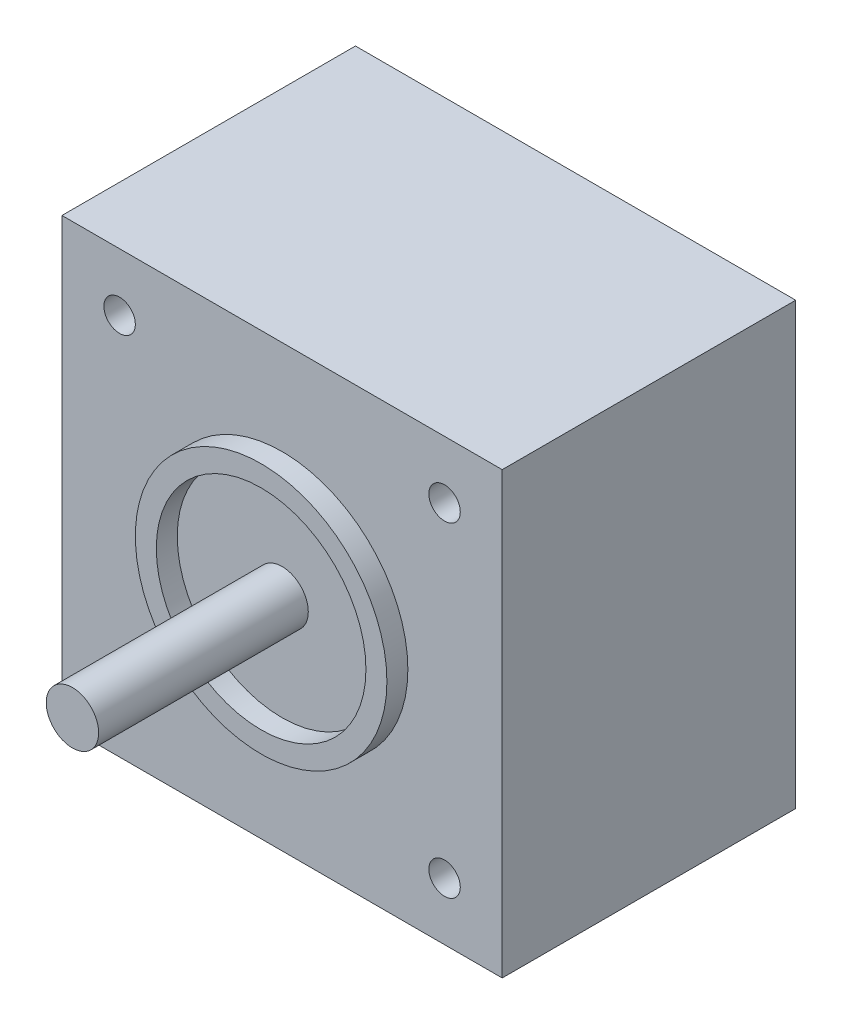
ISO-10303-21;
HEADER;
FILE_DESCRIPTION(('STEP AP214'),'2;1');
FILE_NAME('part.step','',(''),(''),'','','');
FILE_SCHEMA(('AUTOMOTIVE_DESIGN { 1 0 10303 214 1 1 1 1 }'));
ENDSEC;
DATA;
#1=APPLICATION_CONTEXT('core data for automotive mechanical design processes');
#2=APPLICATION_PROTOCOL_DEFINITION('international standard','automotive_design',2000,#1);
#3=PRODUCT_CONTEXT('',#1,'mechanical');
#4=PRODUCT('Part','Part','',(#3));
#5=PRODUCT_RELATED_PRODUCT_CATEGORY('part','',(#4));
#6=PRODUCT_DEFINITION_FORMATION('','',#4);
#7=PRODUCT_DEFINITION_CONTEXT('part definition',#1,'design');
#8=PRODUCT_DEFINITION('design','',#6,#7);
#9=PRODUCT_DEFINITION_SHAPE('','',#8);
#10=(LENGTH_UNIT() NAMED_UNIT(*) SI_UNIT(.MILLI.,.METRE.));
#11=(NAMED_UNIT(*) PLANE_ANGLE_UNIT() SI_UNIT($,.RADIAN.));
#12=(NAMED_UNIT(*) SI_UNIT($,.STERADIAN.) SOLID_ANGLE_UNIT());
#13=UNCERTAINTY_MEASURE_WITH_UNIT(LENGTH_MEASURE(1.E-05),#10,'distance_accuracy_value','');
#14=(GEOMETRIC_REPRESENTATION_CONTEXT(3) GLOBAL_UNCERTAINTY_ASSIGNED_CONTEXT((#13)) GLOBAL_UNIT_ASSIGNED_CONTEXT((#10,
#11,#12)) REPRESENTATION_CONTEXT('',''));
#15=CARTESIAN_POINT('',(0.,0.,0.));
#16=DIRECTION('',(0.,0.,1.));
#17=DIRECTION('',(1.,0.,0.));
#18=AXIS2_PLACEMENT_3D('',#15,#16,#17);
#19=CARTESIAN_POINT('',(-21.,-21.,28.));
#20=DIRECTION('',(0.,1.,0.));
#21=DIRECTION('',(0.,0.,1.));
#22=AXIS2_PLACEMENT_3D('',#19,#20,#21);
#23=PLANE('',#22);
#24=DIRECTION('',(0.,0.,1.));
#25=VECTOR('',#24,1.);
#26=CARTESIAN_POINT('',(7.49999999999999,-21.,0.));
#27=LINE('',#26,#25);
#28=CARTESIAN_POINT('',(7.49999999999999,-21.,0.));
#29=VERTEX_POINT('',#28);
#30=CARTESIAN_POINT('',(7.49999999999999,-21.,8.));
#31=VERTEX_POINT('',#30);
#32=EDGE_CURVE('E158',#29,#31,#27,.T.);
#33=ORIENTED_EDGE('',*,*,#32,.F.);
#34=DIRECTION('',(1.,0.,0.));
#35=VECTOR('',#34,1.);
#36=CARTESIAN_POINT('',(-21.,-21.,0.));
#37=LINE('',#36,#35);
#38=CARTESIAN_POINT('',(21.,-21.,0.));
#39=VERTEX_POINT('',#38);
#40=EDGE_CURVE('E248',#29,#39,#37,.T.);
#41=ORIENTED_EDGE('',*,*,#40,.T.);
#42=DIRECTION('',(0.,0.,-1.));
#43=VECTOR('',#42,1.);
#44=CARTESIAN_POINT('',(21.,-21.,28.));
#45=LINE('',#44,#43);
#46=CARTESIAN_POINT('',(21.,-21.,28.));
#47=VERTEX_POINT('',#46);
#48=EDGE_CURVE('E241',#47,#39,#45,.T.);
#49=ORIENTED_EDGE('',*,*,#48,.F.);
#50=DIRECTION('',(1.,0.,0.));
#51=VECTOR('',#50,1.);
#52=CARTESIAN_POINT('',(-21.,-21.,28.));
#53=LINE('',#52,#51);
#54=CARTESIAN_POINT('',(-21.,-21.,28.));
#55=VERTEX_POINT('',#54);
#56=EDGE_CURVE('E239',#55,#47,#53,.T.);
#57=ORIENTED_EDGE('',*,*,#56,.F.);
#58=DIRECTION('',(0.,0.,-1.));
#59=VECTOR('',#58,1.);
#60=CARTESIAN_POINT('',(-21.,-21.,28.));
#61=LINE('',#60,#59);
#62=CARTESIAN_POINT('',(-21.,-21.,0.));
#63=VERTEX_POINT('',#62);
#64=EDGE_CURVE('E252',#55,#63,#61,.T.);
#65=ORIENTED_EDGE('',*,*,#64,.T.);
#66=CARTESIAN_POINT('',(-7.50000000000001,-21.,0.));
#67=VERTEX_POINT('',#66);
#68=EDGE_CURVE('E235',#63,#67,#37,.T.);
#69=ORIENTED_EDGE('',*,*,#68,.T.);
#70=DIRECTION('',(0.,0.,-1.));
#71=VECTOR('',#70,1.);
#72=CARTESIAN_POINT('',(-7.50000000000001,-21.,0.));
#73=LINE('',#72,#71);
#74=CARTESIAN_POINT('',(-7.50000000000001,-21.,8.));
#75=VERTEX_POINT('',#74);
#76=EDGE_CURVE('E166',#75,#67,#73,.T.);
#77=ORIENTED_EDGE('',*,*,#76,.F.);
#78=DIRECTION('',(-1.,0.,0.));
#79=VECTOR('',#78,1.);
#80=CARTESIAN_POINT('',(7.49999999999999,-21.,8.));
#81=LINE('',#80,#79);
#82=EDGE_CURVE('E57',#31,#75,#81,.T.);
#83=ORIENTED_EDGE('',*,*,#82,.F.);
#84=EDGE_LOOP('',(#33,#41,#49,#57,#65,#69,#77,#83));
#85=FACE_BOUND('',#84,.T.);
#86=ADVANCED_FACE('F34',(#85),#23,.F.);
#87=CARTESIAN_POINT('',(21.,21.,28.));
#88=DIRECTION('',(-1.,0.,0.));
#89=DIRECTION('',(0.,0.,1.));
#90=AXIS2_PLACEMENT_3D('',#87,#88,#89);
#91=PLANE('',#90);
#92=DIRECTION('',(0.,1.,0.));
#93=VECTOR('',#92,1.);
#94=CARTESIAN_POINT('',(21.,21.,0.));
#95=LINE('',#94,#93);
#96=CARTESIAN_POINT('',(21.,21.,0.));
#97=VERTEX_POINT('',#96);
#98=EDGE_CURVE('E228',#39,#97,#95,.T.);
#99=ORIENTED_EDGE('',*,*,#98,.T.);
#100=DIRECTION('',(0.,0.,-1.));
#101=VECTOR('',#100,1.);
#102=CARTESIAN_POINT('',(21.,21.,28.));
#103=LINE('',#102,#101);
#104=CARTESIAN_POINT('',(21.,21.,28.));
#105=VERTEX_POINT('',#104);
#106=EDGE_CURVE('E11',#105,#97,#103,.T.);
#107=ORIENTED_EDGE('',*,*,#106,.F.);
#108=DIRECTION('',(0.,1.,0.));
#109=VECTOR('',#108,1.);
#110=CARTESIAN_POINT('',(21.,21.,28.));
#111=LINE('',#110,#109);
#112=EDGE_CURVE('E231',#47,#105,#111,.T.);
#113=ORIENTED_EDGE('',*,*,#112,.F.);
#114=ORIENTED_EDGE('',*,*,#48,.T.);
#115=EDGE_LOOP('',(#99,#107,#113,#114));
#116=FACE_BOUND('',#115,.T.);
#117=ADVANCED_FACE('F36',(#116),#91,.F.);
#118=CARTESIAN_POINT('',(-21.,21.,28.));
#119=DIRECTION('',(0.,-1.,0.));
#120=DIRECTION('',(0.,0.,-1.));
#121=AXIS2_PLACEMENT_3D('',#118,#119,#120);
#122=PLANE('',#121);
#123=DIRECTION('',(-1.,0.,0.));
#124=VECTOR('',#123,1.);
#125=CARTESIAN_POINT('',(-21.,21.,0.));
#126=LINE('',#125,#124);
#127=CARTESIAN_POINT('',(-21.,21.,0.));
#128=VERTEX_POINT('',#127);
#129=EDGE_CURVE('E244',#97,#128,#126,.T.);
#130=ORIENTED_EDGE('',*,*,#129,.T.);
#131=DIRECTION('',(0.,0.,-1.));
#132=VECTOR('',#131,1.);
#133=CARTESIAN_POINT('',(-21.,21.,28.));
#134=LINE('',#133,#132);
#135=CARTESIAN_POINT('',(-21.,21.,28.));
#136=VERTEX_POINT('',#135);
#137=EDGE_CURVE('E42',#136,#128,#134,.T.);
#138=ORIENTED_EDGE('',*,*,#137,.F.);
#139=DIRECTION('',(-1.,0.,0.));
#140=VECTOR('',#139,1.);
#141=CARTESIAN_POINT('',(-21.,21.,28.));
#142=LINE('',#141,#140);
#143=EDGE_CURVE('E234',#105,#136,#142,.T.);
#144=ORIENTED_EDGE('',*,*,#143,.F.);
#145=ORIENTED_EDGE('',*,*,#106,.T.);
#146=EDGE_LOOP('',(#130,#138,#144,#145));
#147=FACE_BOUND('',#146,.T.);
#148=ADVANCED_FACE('F287',(#147),#122,.F.);
#149=CARTESIAN_POINT('',(-21.,21.,28.));
#150=DIRECTION('',(1.,0.,0.));
#151=DIRECTION('',(0.,1.,0.));
#152=AXIS2_PLACEMENT_3D('',#149,#150,#151);
#153=PLANE('',#152);
#154=DIRECTION('',(0.,-1.,0.));
#155=VECTOR('',#154,1.);
#156=CARTESIAN_POINT('',(-21.,21.,0.));
#157=LINE('',#156,#155);
#158=EDGE_CURVE('E246',#128,#63,#157,.T.);
#159=ORIENTED_EDGE('',*,*,#158,.T.);
#160=ORIENTED_EDGE('',*,*,#64,.F.);
#161=DIRECTION('',(0.,-1.,0.));
#162=VECTOR('',#161,1.);
#163=CARTESIAN_POINT('',(-21.,21.,28.));
#164=LINE('',#163,#162);
#165=EDGE_CURVE('E237',#136,#55,#164,.T.);
#166=ORIENTED_EDGE('',*,*,#165,.F.);
#167=ORIENTED_EDGE('',*,*,#137,.T.);
#168=EDGE_LOOP('',(#159,#160,#166,#167));
#169=FACE_BOUND('',#168,.T.);
#170=ADVANCED_FACE('F259',(#169),#153,.F.);
#171=CARTESIAN_POINT('',(0.,0.,28.));
#172=DIRECTION('',(0.,0.,1.));
#173=DIRECTION('',(1.,0.,0.));
#174=AXIS2_PLACEMENT_3D('',#171,#172,#173);
#175=PLANE('',#174);
#176=CARTESIAN_POINT('',(0.,0.,28.));
#177=DIRECTION('',(0.,0.,1.));
#178=DIRECTION('',(1.,0.,0.));
#179=AXIS2_PLACEMENT_3D('',#176,#177,#178);
#180=CIRCLE('',#179,12.);
#181=CARTESIAN_POINT('',(12.,0.,28.));
#182=VERTEX_POINT('',#181);
#183=EDGE_CURVE('E198',#182,#182,#180,.T.);
#184=ORIENTED_EDGE('',*,*,#183,.F.);
#185=EDGE_LOOP('',(#184));
#186=FACE_BOUND('',#185,.T.);
#187=CARTESIAN_POINT('',(15.5,-15.5,28.));
#188=DIRECTION('',(0.,0.,1.));
#189=DIRECTION('',(1.,0.,0.));
#190=AXIS2_PLACEMENT_3D('',#187,#188,#189);
#191=CIRCLE('',#190,1.5);
#192=CARTESIAN_POINT('',(17.,-15.5,28.));
#193=VERTEX_POINT('',#192);
#194=EDGE_CURVE('E204',#193,#193,#191,.T.);
#195=ORIENTED_EDGE('',*,*,#194,.F.);
#196=EDGE_LOOP('',(#195));
#197=FACE_BOUND('',#196,.T.);
#198=CARTESIAN_POINT('',(-15.5,-15.5,28.));
#199=DIRECTION('',(0.,0.,1.));
#200=DIRECTION('',(1.,0.,0.));
#201=AXIS2_PLACEMENT_3D('',#198,#199,#200);
#202=CIRCLE('',#201,1.5);
#203=CARTESIAN_POINT('',(-14.,-15.5,28.));
#204=VERTEX_POINT('',#203);
#205=EDGE_CURVE('E217',#204,#204,#202,.T.);
#206=ORIENTED_EDGE('',*,*,#205,.F.);
#207=EDGE_LOOP('',(#206));
#208=FACE_BOUND('',#207,.T.);
#209=CARTESIAN_POINT('',(-15.5,15.5,28.));
#210=DIRECTION('',(0.,0.,1.));
#211=DIRECTION('',(1.,0.,0.));
#212=AXIS2_PLACEMENT_3D('',#209,#210,#211);
#213=CIRCLE('',#212,1.5);
#214=CARTESIAN_POINT('',(-14.,15.5,28.));
#215=VERTEX_POINT('',#214);
#216=EDGE_CURVE('E211',#215,#215,#213,.T.);
#217=ORIENTED_EDGE('',*,*,#216,.F.);
#218=EDGE_LOOP('',(#217));
#219=FACE_BOUND('',#218,.T.);
#220=CARTESIAN_POINT('',(15.5,15.5,28.));
#221=DIRECTION('',(0.,0.,1.));
#222=DIRECTION('',(1.,0.,0.));
#223=AXIS2_PLACEMENT_3D('',#220,#221,#222);
#224=CIRCLE('',#223,1.5);
#225=CARTESIAN_POINT('',(17.,15.5,28.));
#226=VERTEX_POINT('',#225);
#227=EDGE_CURVE('E210',#226,#226,#224,.T.);
#228=ORIENTED_EDGE('',*,*,#227,.F.);
#229=EDGE_LOOP('',(#228));
#230=FACE_BOUND('',#229,.T.);
#231=ORIENTED_EDGE('',*,*,#112,.T.);
#232=ORIENTED_EDGE('',*,*,#143,.T.);
#233=ORIENTED_EDGE('',*,*,#165,.T.);
#234=ORIENTED_EDGE('',*,*,#56,.T.);
#235=EDGE_LOOP('',(#231,#232,#233,#234));
#236=FACE_BOUND('',#235,.T.);
#237=ADVANCED_FACE('F286',(#186,#197,#208,#219,#230,#236),#175,.T.);
#238=CARTESIAN_POINT('',(0.,0.,0.));
#239=DIRECTION('',(0.,0.,1.));
#240=DIRECTION('',(1.,0.,0.));
#241=AXIS2_PLACEMENT_3D('',#238,#239,#240);
#242=PLANE('',#241);
#243=ORIENTED_EDGE('',*,*,#98,.F.);
#244=ORIENTED_EDGE('',*,*,#40,.F.);
#245=DIRECTION('',(0.,1.,0.));
#246=VECTOR('',#245,1.);
#247=CARTESIAN_POINT('',(7.49999999999999,-27.,0.));
#248=LINE('',#247,#246);
#249=CARTESIAN_POINT('',(7.49999999999999,-27.,0.));
#250=VERTEX_POINT('',#249);
#251=EDGE_CURVE('E172',#250,#29,#248,.T.);
#252=ORIENTED_EDGE('',*,*,#251,.F.);
#253=DIRECTION('',(1.,0.,0.));
#254=VECTOR('',#253,1.);
#255=CARTESIAN_POINT('',(7.49999999999999,-27.,0.));
#256=LINE('',#255,#254);
#257=CARTESIAN_POINT('',(-7.50000000000001,-27.,0.));
#258=VERTEX_POINT('',#257);
#259=EDGE_CURVE('E170',#258,#250,#256,.T.);
#260=ORIENTED_EDGE('',*,*,#259,.F.);
#261=DIRECTION('',(0.,1.,0.));
#262=VECTOR('',#261,1.);
#263=CARTESIAN_POINT('',(-7.50000000000001,-27.,0.));
#264=LINE('',#263,#262);
#265=EDGE_CURVE('E180',#258,#67,#264,.T.);
#266=ORIENTED_EDGE('',*,*,#265,.T.);
#267=ORIENTED_EDGE('',*,*,#68,.F.);
#268=ORIENTED_EDGE('',*,*,#158,.F.);
#269=ORIENTED_EDGE('',*,*,#129,.F.);
#270=EDGE_LOOP('',(#243,#244,#252,#260,#266,#267,#268,#269));
#271=FACE_BOUND('',#270,.T.);
#272=ADVANCED_FACE('F265',(#271),#242,.F.);
#273=CARTESIAN_POINT('',(15.5,15.5,18.));
#274=DIRECTION('',(0.,0.,1.));
#275=DIRECTION('',(1.,0.,0.));
#276=AXIS2_PLACEMENT_3D('',#273,#274,#275);
#277=CYLINDRICAL_SURFACE('',#276,1.5);
#278=CARTESIAN_POINT('',(15.5,15.5,18.));
#279=DIRECTION('',(0.,0.,1.));
#280=DIRECTION('',(1.,0.,0.));
#281=AXIS2_PLACEMENT_3D('',#278,#279,#280);
#282=CIRCLE('',#281,1.5);
#283=CARTESIAN_POINT('',(17.,15.5,18.));
#284=VERTEX_POINT('',#283);
#285=EDGE_CURVE('E225',#284,#284,#282,.T.);
#286=ORIENTED_EDGE('',*,*,#285,.F.);
#287=EDGE_LOOP('',(#286));
#288=FACE_BOUND('',#287,.T.);
#289=ORIENTED_EDGE('',*,*,#227,.T.);
#290=EDGE_LOOP('',(#289));
#291=FACE_BOUND('',#290,.T.);
#292=ADVANCED_FACE('F301',(#288,#291),#277,.F.);
#293=CARTESIAN_POINT('',(15.5,15.5,18.));
#294=DIRECTION('',(0.,0.,1.));
#295=DIRECTION('',(1.,0.,0.));
#296=AXIS2_PLACEMENT_3D('',#293,#294,#295);
#297=PLANE('',#296);
#298=ORIENTED_EDGE('',*,*,#285,.T.);
#299=EDGE_LOOP('',(#298));
#300=FACE_BOUND('',#299,.T.);
#301=ADVANCED_FACE('F307',(#300),#297,.T.);
#302=CARTESIAN_POINT('',(-15.5,15.5,18.));
#303=DIRECTION('',(0.,0.,1.));
#304=DIRECTION('',(1.,0.,0.));
#305=AXIS2_PLACEMENT_3D('',#302,#303,#304);
#306=CYLINDRICAL_SURFACE('',#305,1.5);
#307=CARTESIAN_POINT('',(-15.5,15.5,18.));
#308=DIRECTION('',(0.,0.,1.));
#309=DIRECTION('',(1.,0.,0.));
#310=AXIS2_PLACEMENT_3D('',#307,#308,#309);
#311=CIRCLE('',#310,1.5);
#312=CARTESIAN_POINT('',(-14.,15.5,18.));
#313=VERTEX_POINT('',#312);
#314=EDGE_CURVE('E207',#313,#313,#311,.T.);
#315=ORIENTED_EDGE('',*,*,#314,.F.);
#316=EDGE_LOOP('',(#315));
#317=FACE_BOUND('',#316,.T.);
#318=ORIENTED_EDGE('',*,*,#216,.T.);
#319=EDGE_LOOP('',(#318));
#320=FACE_BOUND('',#319,.T.);
#321=ADVANCED_FACE('F311',(#317,#320),#306,.F.);
#322=CARTESIAN_POINT('',(-15.5,15.5,18.));
#323=DIRECTION('',(0.,0.,1.));
#324=DIRECTION('',(1.,0.,0.));
#325=AXIS2_PLACEMENT_3D('',#322,#323,#324);
#326=PLANE('',#325);
#327=ORIENTED_EDGE('',*,*,#314,.T.);
#328=EDGE_LOOP('',(#327));
#329=FACE_BOUND('',#328,.T.);
#330=ADVANCED_FACE('F326',(#329),#326,.T.);
#331=CARTESIAN_POINT('',(-15.5,-15.5,18.));
#332=DIRECTION('',(0.,0.,1.));
#333=DIRECTION('',(1.,0.,0.));
#334=AXIS2_PLACEMENT_3D('',#331,#332,#333);
#335=CYLINDRICAL_SURFACE('',#334,1.5);
#336=CARTESIAN_POINT('',(-15.5,-15.5,18.));
#337=DIRECTION('',(0.,0.,1.));
#338=DIRECTION('',(1.,0.,0.));
#339=AXIS2_PLACEMENT_3D('',#336,#337,#338);
#340=CIRCLE('',#339,1.5);
#341=CARTESIAN_POINT('',(-14.,-15.5,18.));
#342=VERTEX_POINT('',#341);
#343=EDGE_CURVE('E214',#342,#342,#340,.T.);
#344=ORIENTED_EDGE('',*,*,#343,.F.);
#345=EDGE_LOOP('',(#344));
#346=FACE_BOUND('',#345,.T.);
#347=ORIENTED_EDGE('',*,*,#205,.T.);
#348=EDGE_LOOP('',(#347));
#349=FACE_BOUND('',#348,.T.);
#350=ADVANCED_FACE('F323',(#346,#349),#335,.F.);
#351=CARTESIAN_POINT('',(-15.5,-15.5,18.));
#352=DIRECTION('',(0.,0.,1.));
#353=DIRECTION('',(1.,0.,0.));
#354=AXIS2_PLACEMENT_3D('',#351,#352,#353);
#355=PLANE('',#354);
#356=ORIENTED_EDGE('',*,*,#343,.T.);
#357=EDGE_LOOP('',(#356));
#358=FACE_BOUND('',#357,.T.);
#359=ADVANCED_FACE('F317',(#358),#355,.T.);
#360=CARTESIAN_POINT('',(15.5,-15.5,18.));
#361=DIRECTION('',(0.,0.,1.));
#362=DIRECTION('',(1.,0.,0.));
#363=AXIS2_PLACEMENT_3D('',#360,#361,#362);
#364=CYLINDRICAL_SURFACE('',#363,1.5);
#365=CARTESIAN_POINT('',(15.5,-15.5,18.));
#366=DIRECTION('',(0.,0.,1.));
#367=DIRECTION('',(1.,0.,0.));
#368=AXIS2_PLACEMENT_3D('',#365,#366,#367);
#369=CIRCLE('',#368,1.5);
#370=CARTESIAN_POINT('',(17.,-15.5,18.));
#371=VERTEX_POINT('',#370);
#372=EDGE_CURVE('E220',#371,#371,#369,.T.);
#373=ORIENTED_EDGE('',*,*,#372,.F.);
#374=EDGE_LOOP('',(#373));
#375=FACE_BOUND('',#374,.T.);
#376=ORIENTED_EDGE('',*,*,#194,.T.);
#377=EDGE_LOOP('',(#376));
#378=FACE_BOUND('',#377,.T.);
#379=ADVANCED_FACE('F313',(#375,#378),#364,.F.);
#380=CARTESIAN_POINT('',(15.5,-15.5,18.));
#381=DIRECTION('',(0.,0.,1.));
#382=DIRECTION('',(1.,0.,0.));
#383=AXIS2_PLACEMENT_3D('',#380,#381,#382);
#384=PLANE('',#383);
#385=ORIENTED_EDGE('',*,*,#372,.T.);
#386=EDGE_LOOP('',(#385));
#387=FACE_BOUND('',#386,.T.);
#388=ADVANCED_FACE('F316',(#387),#384,.T.);
#389=CARTESIAN_POINT('',(0.,0.,30.));
#390=DIRECTION('',(0.,0.,-1.));
#391=DIRECTION('',(-1.,0.,0.));
#392=AXIS2_PLACEMENT_3D('',#389,#390,#391);
#393=CYLINDRICAL_SURFACE('',#392,12.);
#394=CARTESIAN_POINT('',(0.,0.,30.));
#395=DIRECTION('',(0.,0.,1.));
#396=DIRECTION('',(1.,0.,0.));
#397=AXIS2_PLACEMENT_3D('',#394,#395,#396);
#398=CIRCLE('',#397,12.);
#399=CARTESIAN_POINT('',(12.,0.,30.));
#400=VERTEX_POINT('',#399);
#401=EDGE_CURVE('E201',#400,#400,#398,.T.);
#402=ORIENTED_EDGE('',*,*,#401,.F.);
#403=EDGE_LOOP('',(#402));
#404=FACE_BOUND('',#403,.T.);
#405=ORIENTED_EDGE('',*,*,#183,.T.);
#406=EDGE_LOOP('',(#405));
#407=FACE_BOUND('',#406,.T.);
#408=ADVANCED_FACE('F321',(#404,#407),#393,.T.);
#409=CARTESIAN_POINT('',(0.,0.,30.));
#410=DIRECTION('',(0.,0.,1.));
#411=DIRECTION('',(1.,0.,0.));
#412=AXIS2_PLACEMENT_3D('',#409,#410,#411);
#413=PLANE('',#412);
#414=CARTESIAN_POINT('',(0.,0.,30.));
#415=DIRECTION('',(0.,0.,1.));
#416=DIRECTION('',(1.,0.,0.));
#417=AXIS2_PLACEMENT_3D('',#414,#415,#416);
#418=CIRCLE('',#417,10.);
#419=CARTESIAN_POINT('',(10.,0.,30.));
#420=VERTEX_POINT('',#419);
#421=EDGE_CURVE('E192',#420,#420,#418,.T.);
#422=ORIENTED_EDGE('',*,*,#421,.F.);
#423=EDGE_LOOP('',(#422));
#424=FACE_BOUND('',#423,.T.);
#425=ORIENTED_EDGE('',*,*,#401,.T.);
#426=EDGE_LOOP('',(#425));
#427=FACE_BOUND('',#426,.T.);
#428=ADVANCED_FACE('F339',(#424,#427),#413,.T.);
#429=CARTESIAN_POINT('',(0.,0.,28.));
#430=DIRECTION('',(0.,0.,1.));
#431=DIRECTION('',(1.,0.,0.));
#432=AXIS2_PLACEMENT_3D('',#429,#430,#431);
#433=CYLINDRICAL_SURFACE('',#432,10.);
#434=CARTESIAN_POINT('',(0.,0.,28.));
#435=DIRECTION('',(0.,0.,1.));
#436=DIRECTION('',(1.,0.,0.));
#437=AXIS2_PLACEMENT_3D('',#434,#435,#436);
#438=CIRCLE('',#437,10.);
#439=CARTESIAN_POINT('',(10.,0.,28.));
#440=VERTEX_POINT('',#439);
#441=EDGE_CURVE('E195',#440,#440,#438,.T.);
#442=ORIENTED_EDGE('',*,*,#441,.F.);
#443=EDGE_LOOP('',(#442));
#444=FACE_BOUND('',#443,.T.);
#445=ORIENTED_EDGE('',*,*,#421,.T.);
#446=EDGE_LOOP('',(#445));
#447=FACE_BOUND('',#446,.T.);
#448=ADVANCED_FACE('F343',(#444,#447),#433,.F.);
#449=CARTESIAN_POINT('',(0.,0.,28.));
#450=DIRECTION('',(0.,0.,1.));
#451=DIRECTION('',(1.,0.,0.));
#452=AXIS2_PLACEMENT_3D('',#449,#450,#451);
#453=PLANE('',#452);
#454=CARTESIAN_POINT('',(0.,0.,28.));
#455=DIRECTION('',(0.,0.,1.));
#456=DIRECTION('',(1.,0.,0.));
#457=AXIS2_PLACEMENT_3D('',#454,#455,#456);
#458=CIRCLE('',#457,2.5);
#459=CARTESIAN_POINT('',(2.5,0.,28.));
#460=VERTEX_POINT('',#459);
#461=EDGE_CURVE('E188',#460,#460,#458,.T.);
#462=ORIENTED_EDGE('',*,*,#461,.F.);
#463=EDGE_LOOP('',(#462));
#464=FACE_BOUND('',#463,.T.);
#465=ORIENTED_EDGE('',*,*,#441,.T.);
#466=EDGE_LOOP('',(#465));
#467=FACE_BOUND('',#466,.T.);
#468=ADVANCED_FACE('F347',(#464,#467),#453,.T.);
#469=CARTESIAN_POINT('',(0.,0.,48.));
#470=DIRECTION('',(0.,0.,-1.));
#471=DIRECTION('',(-1.,0.,0.));
#472=AXIS2_PLACEMENT_3D('',#469,#470,#471);
#473=CYLINDRICAL_SURFACE('',#472,2.5);
#474=CARTESIAN_POINT('',(0.,0.,48.));
#475=DIRECTION('',(0.,0.,1.));
#476=DIRECTION('',(1.,0.,0.));
#477=AXIS2_PLACEMENT_3D('',#474,#475,#476);
#478=CIRCLE('',#477,2.5);
#479=CARTESIAN_POINT('',(2.5,0.,48.));
#480=VERTEX_POINT('',#479);
#481=EDGE_CURVE('E189',#480,#480,#478,.T.);
#482=ORIENTED_EDGE('',*,*,#481,.F.);
#483=EDGE_LOOP('',(#482));
#484=FACE_BOUND('',#483,.T.);
#485=ORIENTED_EDGE('',*,*,#461,.T.);
#486=EDGE_LOOP('',(#485));
#487=FACE_BOUND('',#486,.T.);
#488=ADVANCED_FACE('F351',(#484,#487),#473,.T.);
#489=CARTESIAN_POINT('',(0.,0.,48.));
#490=DIRECTION('',(0.,0.,1.));
#491=DIRECTION('',(1.,0.,0.));
#492=AXIS2_PLACEMENT_3D('',#489,#490,#491);
#493=PLANE('',#492);
#494=ORIENTED_EDGE('',*,*,#481,.T.);
#495=EDGE_LOOP('',(#494));
#496=FACE_BOUND('',#495,.T.);
#497=ADVANCED_FACE('F355',(#496),#493,.T.);
#498=CARTESIAN_POINT('',(7.49999999999999,-27.,0.));
#499=DIRECTION('',(-1.,0.,0.));
#500=DIRECTION('',(0.,0.,1.));
#501=AXIS2_PLACEMENT_3D('',#498,#499,#500);
#502=PLANE('',#501);
#503=ORIENTED_EDGE('',*,*,#32,.T.);
#504=DIRECTION('',(0.,1.,0.));
#505=VECTOR('',#504,1.);
#506=CARTESIAN_POINT('',(7.49999999999999,-27.,8.));
#507=LINE('',#506,#505);
#508=CARTESIAN_POINT('',(7.49999999999999,-27.,8.));
#509=VERTEX_POINT('',#508);
#510=EDGE_CURVE('E186',#509,#31,#507,.T.);
#511=ORIENTED_EDGE('',*,*,#510,.F.);
#512=DIRECTION('',(0.,0.,1.));
#513=VECTOR('',#512,1.);
#514=CARTESIAN_POINT('',(7.49999999999999,-27.,0.));
#515=LINE('',#514,#513);
#516=EDGE_CURVE('E162',#250,#509,#515,.T.);
#517=ORIENTED_EDGE('',*,*,#516,.F.);
#518=ORIENTED_EDGE('',*,*,#251,.T.);
#519=EDGE_LOOP('',(#503,#511,#517,#518));
#520=FACE_BOUND('',#519,.T.);
#521=ADVANCED_FACE('F278',(#520),#502,.F.);
#522=CARTESIAN_POINT('',(7.49999999999999,-27.,8.));
#523=DIRECTION('',(0.,0.,-1.));
#524=DIRECTION('',(-1.,0.,0.));
#525=AXIS2_PLACEMENT_3D('',#522,#523,#524);
#526=PLANE('',#525);
#527=ORIENTED_EDGE('',*,*,#82,.T.);
#528=DIRECTION('',(0.,1.,0.));
#529=VECTOR('',#528,1.);
#530=CARTESIAN_POINT('',(-7.50000000000001,-27.,8.));
#531=LINE('',#530,#529);
#532=CARTESIAN_POINT('',(-7.50000000000001,-27.,8.));
#533=VERTEX_POINT('',#532);
#534=EDGE_CURVE('E183',#533,#75,#531,.T.);
#535=ORIENTED_EDGE('',*,*,#534,.F.);
#536=DIRECTION('',(-1.,0.,0.));
#537=VECTOR('',#536,1.);
#538=CARTESIAN_POINT('',(7.49999999999999,-27.,8.));
#539=LINE('',#538,#537);
#540=EDGE_CURVE('E165',#509,#533,#539,.T.);
#541=ORIENTED_EDGE('',*,*,#540,.F.);
#542=ORIENTED_EDGE('',*,*,#510,.T.);
#543=EDGE_LOOP('',(#527,#535,#541,#542));
#544=FACE_BOUND('',#543,.T.);
#545=ADVANCED_FACE('F274',(#544),#526,.F.);
#546=CARTESIAN_POINT('',(-7.50000000000001,-27.,0.));
#547=DIRECTION('',(1.,0.,0.));
#548=DIRECTION('',(0.,0.,-1.));
#549=AXIS2_PLACEMENT_3D('',#546,#547,#548);
#550=PLANE('',#549);
#551=ORIENTED_EDGE('',*,*,#76,.T.);
#552=ORIENTED_EDGE('',*,*,#265,.F.);
#553=DIRECTION('',(0.,0.,-1.));
#554=VECTOR('',#553,1.);
#555=CARTESIAN_POINT('',(-7.50000000000001,-27.,0.));
#556=LINE('',#555,#554);
#557=EDGE_CURVE('E168',#533,#258,#556,.T.);
#558=ORIENTED_EDGE('',*,*,#557,.F.);
#559=ORIENTED_EDGE('',*,*,#534,.T.);
#560=EDGE_LOOP('',(#551,#552,#558,#559));
#561=FACE_BOUND('',#560,.T.);
#562=ADVANCED_FACE('F270',(#561),#550,.F.);
#563=CARTESIAN_POINT('',(0.,-27.,0.));
#564=DIRECTION('',(0.,-1.,0.));
#565=DIRECTION('',(0.,0.,-1.));
#566=AXIS2_PLACEMENT_3D('',#563,#564,#565);
#567=PLANE('',#566);
#568=DIRECTION('',(0.,0.,-1.));
#569=VECTOR('',#568,1.);
#570=CARTESIAN_POINT('',(-6.50000000000001,-27.,7.));
#571=LINE('',#570,#569);
#572=CARTESIAN_POINT('',(-6.50000000000001,-27.,7.));
#573=VERTEX_POINT('',#572);
#574=CARTESIAN_POINT('',(-6.50000000000001,-27.,0.999999999999998));
#575=VERTEX_POINT('',#574);
#576=EDGE_CURVE('E49',#573,#575,#571,.T.);
#577=ORIENTED_EDGE('',*,*,#576,.F.);
#578=DIRECTION('',(-1.,0.,0.));
#579=VECTOR('',#578,1.);
#580=CARTESIAN_POINT('',(-6.50000000000001,-27.,7.));
#581=LINE('',#580,#579);
#582=CARTESIAN_POINT('',(6.49999999999998,-27.,7.));
#583=VERTEX_POINT('',#582);
#584=EDGE_CURVE('E143',#583,#573,#581,.T.);
#585=ORIENTED_EDGE('',*,*,#584,.F.);
#586=DIRECTION('',(0.,0.,1.));
#587=VECTOR('',#586,1.);
#588=CARTESIAN_POINT('',(6.49999999999998,-27.,7.));
#589=LINE('',#588,#587);
#590=CARTESIAN_POINT('',(6.49999999999998,-27.,1.));
#591=VERTEX_POINT('',#590);
#592=EDGE_CURVE('E146',#591,#583,#589,.T.);
#593=ORIENTED_EDGE('',*,*,#592,.F.);
#594=DIRECTION('',(1.,0.,0.));
#595=VECTOR('',#594,1.);
#596=CARTESIAN_POINT('',(-6.50000000000001,-27.,0.999999999999998));
#597=LINE('',#596,#595);
#598=EDGE_CURVE('E152',#575,#591,#597,.T.);
#599=ORIENTED_EDGE('',*,*,#598,.F.);
#600=EDGE_LOOP('',(#577,#585,#593,#599));
#601=FACE_BOUND('',#600,.T.);
#602=ORIENTED_EDGE('',*,*,#516,.T.);
#603=ORIENTED_EDGE('',*,*,#540,.T.);
#604=ORIENTED_EDGE('',*,*,#557,.T.);
#605=ORIENTED_EDGE('',*,*,#259,.T.);
#606=EDGE_LOOP('',(#602,#603,#604,#605));
#607=FACE_BOUND('',#606,.T.);
#608=ADVANCED_FACE('F366',(#601,#607),#567,.T.);
#609=CARTESIAN_POINT('',(-6.50000000000001,-21.,7.));
#610=DIRECTION('',(-1.,0.,0.));
#611=DIRECTION('',(0.,0.,1.));
#612=AXIS2_PLACEMENT_3D('',#609,#610,#611);
#613=PLANE('',#612);
#614=ORIENTED_EDGE('',*,*,#576,.T.);
#615=DIRECTION('',(0.,-1.,0.));
#616=VECTOR('',#615,1.);
#617=CARTESIAN_POINT('',(-6.50000000000001,-21.,0.999999999999998));
#618=LINE('',#617,#616);
#619=CARTESIAN_POINT('',(-6.50000000000001,-21.,0.999999999999998));
#620=VERTEX_POINT('',#619);
#621=EDGE_CURVE('E121',#620,#575,#618,.T.);
#622=ORIENTED_EDGE('',*,*,#621,.F.);
#623=DIRECTION('',(0.,0.,-1.));
#624=VECTOR('',#623,1.);
#625=CARTESIAN_POINT('',(-6.50000000000001,-21.,7.));
#626=LINE('',#625,#624);
#627=CARTESIAN_POINT('',(-6.50000000000001,-21.,7.));
#628=VERTEX_POINT('',#627);
#629=EDGE_CURVE('E125',#628,#620,#626,.T.);
#630=ORIENTED_EDGE('',*,*,#629,.F.);
#631=DIRECTION('',(0.,-1.,0.));
#632=VECTOR('',#631,1.);
#633=CARTESIAN_POINT('',(-6.50000000000001,-21.,7.));
#634=LINE('',#633,#632);
#635=EDGE_CURVE('E156',#628,#573,#634,.T.);
#636=ORIENTED_EDGE('',*,*,#635,.T.);
#637=EDGE_LOOP('',(#614,#622,#630,#636));
#638=FACE_BOUND('',#637,.T.);
#639=ADVANCED_FACE('F123',(#638),#613,.F.);
#640=CARTESIAN_POINT('',(-6.50000000000001,-21.,7.));
#641=DIRECTION('',(0.,0.,1.));
#642=DIRECTION('',(1.,0.,0.));
#643=AXIS2_PLACEMENT_3D('',#640,#641,#642);
#644=PLANE('',#643);
#645=ORIENTED_EDGE('',*,*,#584,.T.);
#646=ORIENTED_EDGE('',*,*,#635,.F.);
#647=DIRECTION('',(-1.,0.,0.));
#648=VECTOR('',#647,1.);
#649=CARTESIAN_POINT('',(-6.50000000000001,-21.,7.));
#650=LINE('',#649,#648);
#651=CARTESIAN_POINT('',(6.49999999999998,-21.,7.));
#652=VERTEX_POINT('',#651);
#653=EDGE_CURVE('E131',#652,#628,#650,.T.);
#654=ORIENTED_EDGE('',*,*,#653,.F.);
#655=DIRECTION('',(0.,-1.,0.));
#656=VECTOR('',#655,1.);
#657=CARTESIAN_POINT('',(6.49999999999998,-21.,7.));
#658=LINE('',#657,#656);
#659=EDGE_CURVE('E159',#652,#583,#658,.T.);
#660=ORIENTED_EDGE('',*,*,#659,.T.);
#661=EDGE_LOOP('',(#645,#646,#654,#660));
#662=FACE_BOUND('',#661,.T.);
#663=ADVANCED_FACE('F372',(#662),#644,.F.);
#664=CARTESIAN_POINT('',(6.49999999999998,-21.,7.));
#665=DIRECTION('',(1.,0.,0.));
#666=DIRECTION('',(0.,0.,-1.));
#667=AXIS2_PLACEMENT_3D('',#664,#665,#666);
#668=PLANE('',#667);
#669=ORIENTED_EDGE('',*,*,#592,.T.);
#670=ORIENTED_EDGE('',*,*,#659,.F.);
#671=DIRECTION('',(0.,0.,1.));
#672=VECTOR('',#671,1.);
#673=CARTESIAN_POINT('',(6.49999999999998,-21.,7.));
#674=LINE('',#673,#672);
#675=CARTESIAN_POINT('',(6.49999999999998,-21.,1.));
#676=VERTEX_POINT('',#675);
#677=EDGE_CURVE('E139',#676,#652,#674,.T.);
#678=ORIENTED_EDGE('',*,*,#677,.F.);
#679=DIRECTION('',(0.,-1.,0.));
#680=VECTOR('',#679,1.);
#681=CARTESIAN_POINT('',(6.49999999999998,-21.,1.));
#682=LINE('',#681,#680);
#683=EDGE_CURVE('E130',#676,#591,#682,.T.);
#684=ORIENTED_EDGE('',*,*,#683,.T.);
#685=EDGE_LOOP('',(#669,#670,#678,#684));
#686=FACE_BOUND('',#685,.T.);
#687=ADVANCED_FACE('F375',(#686),#668,.F.);
#688=CARTESIAN_POINT('',(-6.50000000000001,-21.,0.999999999999998));
#689=DIRECTION('',(0.,0.,-1.));
#690=DIRECTION('',(-1.,0.,0.));
#691=AXIS2_PLACEMENT_3D('',#688,#689,#690);
#692=PLANE('',#691);
#693=ORIENTED_EDGE('',*,*,#598,.T.);
#694=ORIENTED_EDGE('',*,*,#683,.F.);
#695=DIRECTION('',(1.,0.,0.));
#696=VECTOR('',#695,1.);
#697=CARTESIAN_POINT('',(-6.50000000000001,-21.,0.999999999999998));
#698=LINE('',#697,#696);
#699=EDGE_CURVE('E134',#620,#676,#698,.T.);
#700=ORIENTED_EDGE('',*,*,#699,.F.);
#701=ORIENTED_EDGE('',*,*,#621,.T.);
#702=EDGE_LOOP('',(#693,#694,#700,#701));
#703=FACE_BOUND('',#702,.T.);
#704=ADVANCED_FACE('F135',(#703),#692,.F.);
#705=CARTESIAN_POINT('',(0.,-21.,0.));
#706=DIRECTION('',(0.,-1.,0.));
#707=DIRECTION('',(0.,0.,-1.));
#708=AXIS2_PLACEMENT_3D('',#705,#706,#707);
#709=PLANE('',#708);
#710=ORIENTED_EDGE('',*,*,#629,.T.);
#711=ORIENTED_EDGE('',*,*,#699,.T.);
#712=ORIENTED_EDGE('',*,*,#677,.T.);
#713=ORIENTED_EDGE('',*,*,#653,.T.);
#714=EDGE_LOOP('',(#710,#711,#712,#713));
#715=FACE_BOUND('',#714,.T.);
#716=ADVANCED_FACE('F141',(#715),#709,.T.);
#717=CLOSED_SHELL('',(#86,#117,#148,#170,#237,#272,#292,#301,#321,#330,#350,#359,#379,#388,#408,
#428,#448,#468,#488,#497,#521,#545,#562,#608,#639,#663,#687,#704,#716));
#718=MANIFOLD_SOLID_BREP('B2',#717);
#719=ADVANCED_BREP_SHAPE_REPRESENTATION('',(#18,#718),#14);
#720=SHAPE_DEFINITION_REPRESENTATION(#9,#719);
ENDSEC;
END-ISO-10303-21;
